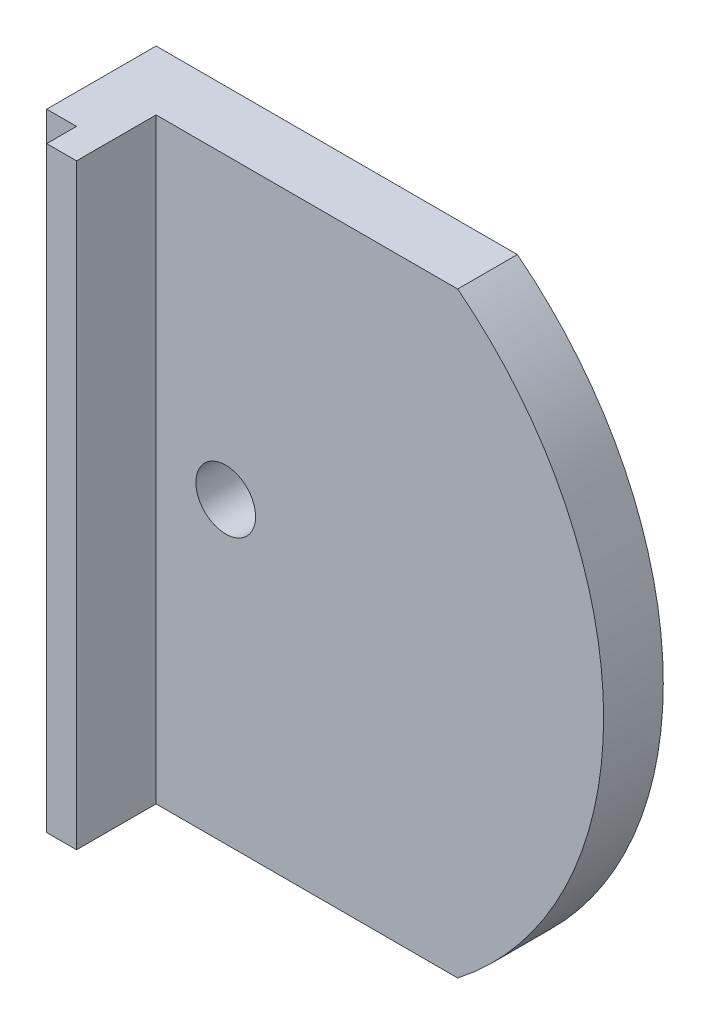
ISO-10303-21;
HEADER;
FILE_DESCRIPTION(('STEP AP214'),'2;1');
FILE_NAME('part.step','',(''),(''),'','','');
FILE_SCHEMA(('AUTOMOTIVE_DESIGN { 1 0 10303 214 1 1 1 1 }'));
ENDSEC;
DATA;
#1=APPLICATION_CONTEXT('core data for automotive mechanical design processes');
#2=APPLICATION_PROTOCOL_DEFINITION('international standard','automotive_design',2000,#1);
#3=PRODUCT_CONTEXT('',#1,'mechanical');
#4=PRODUCT('Part','Part','',(#3));
#5=PRODUCT_RELATED_PRODUCT_CATEGORY('part','',(#4));
#6=PRODUCT_DEFINITION_FORMATION('','',#4);
#7=PRODUCT_DEFINITION_CONTEXT('part definition',#1,'design');
#8=PRODUCT_DEFINITION('design','',#6,#7);
#9=PRODUCT_DEFINITION_SHAPE('','',#8);
#10=(LENGTH_UNIT() NAMED_UNIT(*) SI_UNIT(.MILLI.,.METRE.));
#11=(NAMED_UNIT(*) PLANE_ANGLE_UNIT() SI_UNIT($,.RADIAN.));
#12=(NAMED_UNIT(*) SI_UNIT($,.STERADIAN.) SOLID_ANGLE_UNIT());
#13=UNCERTAINTY_MEASURE_WITH_UNIT(LENGTH_MEASURE(1.E-05),#10,'distance_accuracy_value','');
#14=(GEOMETRIC_REPRESENTATION_CONTEXT(3) GLOBAL_UNCERTAINTY_ASSIGNED_CONTEXT((#13)) GLOBAL_UNIT_ASSIGNED_CONTEXT((#10,
#11,#12)) REPRESENTATION_CONTEXT('',''));
#15=CARTESIAN_POINT('',(0.,0.,0.));
#16=DIRECTION('',(0.,0.,1.));
#17=DIRECTION('',(1.,0.,0.));
#18=AXIS2_PLACEMENT_3D('',#15,#16,#17);
#19=CARTESIAN_POINT('',(0.,15.,0.));
#20=DIRECTION('',(0.,0.,-1.));
#21=DIRECTION('',(-1.,0.,0.));
#22=AXIS2_PLACEMENT_3D('',#19,#20,#21);
#23=PLANE('',#22);
#24=CARTESIAN_POINT('',(6.5,0.,0.));
#25=DIRECTION('',(0.,0.,-1.));
#26=DIRECTION('',(1.,0.,0.));
#27=AXIS2_PLACEMENT_3D('',#24,#25,#26);
#28=CIRCLE('',#27,19.);
#29=CARTESIAN_POINT('',(18.1619037896906,15.,0.));
#30=VERTEX_POINT('',#29);
#31=CARTESIAN_POINT('',(18.1619037896906,-15.,0.));
#32=VERTEX_POINT('',#31);
#33=EDGE_CURVE('E128',#30,#32,#28,.T.);
#34=ORIENTED_EDGE('',*,*,#33,.T.);
#35=DIRECTION('',(1.,0.,0.));
#36=VECTOR('',#35,1.);
#37=CARTESIAN_POINT('',(0.,-15.,0.));
#38=LINE('',#37,#36);
#39=CARTESIAN_POINT('',(0.,-15.,0.));
#40=VERTEX_POINT('',#39);
#41=EDGE_CURVE('E157',#40,#32,#38,.T.);
#42=ORIENTED_EDGE('',*,*,#41,.F.);
#43=DIRECTION('',(0.,-1.,0.));
#44=VECTOR('',#43,1.);
#45=CARTESIAN_POINT('',(0.,15.,0.));
#46=LINE('',#45,#44);
#47=CARTESIAN_POINT('',(0.,15.,0.));
#48=VERTEX_POINT('',#47);
#49=EDGE_CURVE('E11',#48,#40,#46,.T.);
#50=ORIENTED_EDGE('',*,*,#49,.F.);
#51=DIRECTION('',(1.,0.,0.));
#52=VECTOR('',#51,1.);
#53=CARTESIAN_POINT('',(0.,15.,0.));
#54=LINE('',#53,#52);
#55=EDGE_CURVE('E143',#48,#30,#54,.T.);
#56=ORIENTED_EDGE('',*,*,#55,.T.);
#57=EDGE_LOOP('',(#34,#42,#50,#56));
#58=FACE_BOUND('',#57,.T.);
#59=CARTESIAN_POINT('',(6.5,0.,0.));
#60=DIRECTION('',(0.,0.,-1.));
#61=DIRECTION('',(-1.,0.,0.));
#62=AXIS2_PLACEMENT_3D('',#59,#60,#61);
#63=CIRCLE('',#62,6.);
#64=CARTESIAN_POINT('',(0.5,0.,0.));
#65=VERTEX_POINT('',#64);
#66=EDGE_CURVE('E120',#65,#65,#63,.T.);
#67=ORIENTED_EDGE('',*,*,#66,.F.);
#68=EDGE_LOOP('',(#67));
#69=FACE_BOUND('',#68,.T.);
#70=ADVANCED_FACE('F32',(#58,#69),#23,.T.);
#71=CARTESIAN_POINT('',(0.,15.,3.));
#72=DIRECTION('',(0.,0.,-1.));
#73=DIRECTION('',(-1.,0.,0.));
#74=AXIS2_PLACEMENT_3D('',#71,#72,#73);
#75=PLANE('',#74);
#76=CARTESIAN_POINT('',(6.5,0.,3.));
#77=DIRECTION('',(0.,0.,1.));
#78=DIRECTION('',(1.,0.,0.));
#79=AXIS2_PLACEMENT_3D('',#76,#77,#78);
#80=CIRCLE('',#79,1.5);
#81=CARTESIAN_POINT('',(8.,0.,3.));
#82=VERTEX_POINT('',#81);
#83=EDGE_CURVE('E135',#82,#82,#80,.T.);
#84=ORIENTED_EDGE('',*,*,#83,.F.);
#85=EDGE_LOOP('',(#84));
#86=FACE_BOUND('',#85,.T.);
#87=DIRECTION('',(1.,0.,0.));
#88=VECTOR('',#87,1.);
#89=CARTESIAN_POINT('',(0.,-15.,3.));
#90=LINE('',#89,#88);
#91=CARTESIAN_POINT('',(3.,-15.,3.));
#92=VERTEX_POINT('',#91);
#93=CARTESIAN_POINT('',(18.1619037896906,-15.,3.));
#94=VERTEX_POINT('',#93);
#95=EDGE_CURVE('E139',#92,#94,#90,.T.);
#96=ORIENTED_EDGE('',*,*,#95,.T.);
#97=CARTESIAN_POINT('',(6.5,0.,3.));
#98=DIRECTION('',(0.,0.,-1.));
#99=DIRECTION('',(1.,0.,0.));
#100=AXIS2_PLACEMENT_3D('',#97,#98,#99);
#101=CIRCLE('',#100,19.);
#102=CARTESIAN_POINT('',(18.1619037896906,15.,3.));
#103=VERTEX_POINT('',#102);
#104=EDGE_CURVE('E55',#103,#94,#101,.T.);
#105=ORIENTED_EDGE('',*,*,#104,.F.);
#106=DIRECTION('',(1.,0.,0.));
#107=VECTOR('',#106,1.);
#108=CARTESIAN_POINT('',(0.,15.,3.));
#109=LINE('',#108,#107);
#110=CARTESIAN_POINT('',(3.,15.,3.));
#111=VERTEX_POINT('',#110);
#112=EDGE_CURVE('E140',#111,#103,#109,.T.);
#113=ORIENTED_EDGE('',*,*,#112,.F.);
#114=DIRECTION('',(0.,-1.,0.));
#115=VECTOR('',#114,1.);
#116=CARTESIAN_POINT('',(3.,15.,3.));
#117=LINE('',#116,#115);
#118=EDGE_CURVE('E154',#111,#92,#117,.T.);
#119=ORIENTED_EDGE('',*,*,#118,.T.);
#120=EDGE_LOOP('',(#96,#105,#113,#119));
#121=FACE_BOUND('',#120,.T.);
#122=ADVANCED_FACE('F34',(#86,#121),#75,.F.);
#123=CARTESIAN_POINT('',(0.,15.,7.));
#124=DIRECTION('',(-1.,0.,0.));
#125=DIRECTION('',(0.,0.,1.));
#126=AXIS2_PLACEMENT_3D('',#123,#124,#125);
#127=PLANE('',#126);
#128=DIRECTION('',(0.,1.,0.));
#129=VECTOR('',#128,1.);
#130=CARTESIAN_POINT('',(0.,-15.,5.5));
#131=LINE('',#130,#129);
#132=CARTESIAN_POINT('',(0.,-15.,5.5));
#133=VERTEX_POINT('',#132);
#134=CARTESIAN_POINT('',(0.,15.,5.5));
#135=VERTEX_POINT('',#134);
#136=EDGE_CURVE('E47',#133,#135,#131,.T.);
#137=ORIENTED_EDGE('',*,*,#136,.T.);
#138=DIRECTION('',(0.,0.,-1.));
#139=VECTOR('',#138,1.);
#140=CARTESIAN_POINT('',(0.,15.,7.));
#141=LINE('',#140,#139);
#142=EDGE_CURVE('E147',#135,#48,#141,.T.);
#143=ORIENTED_EDGE('',*,*,#142,.T.);
#144=ORIENTED_EDGE('',*,*,#49,.T.);
#145=DIRECTION('',(0.,0.,-1.));
#146=VECTOR('',#145,1.);
#147=CARTESIAN_POINT('',(0.,-15.,7.));
#148=LINE('',#147,#146);
#149=EDGE_CURVE('E160',#133,#40,#148,.T.);
#150=ORIENTED_EDGE('',*,*,#149,.F.);
#151=EDGE_LOOP('',(#137,#143,#144,#150));
#152=FACE_BOUND('',#151,.T.);
#153=ADVANCED_FACE('F178',(#152),#127,.T.);
#154=CARTESIAN_POINT('',(3.,15.,7.));
#155=DIRECTION('',(0.,0.,1.));
#156=DIRECTION('',(1.,0.,0.));
#157=AXIS2_PLACEMENT_3D('',#154,#155,#156);
#158=PLANE('',#157);
#159=DIRECTION('',(0.,1.,0.));
#160=VECTOR('',#159,1.);
#161=CARTESIAN_POINT('',(1.5,-15.,7.));
#162=LINE('',#161,#160);
#163=CARTESIAN_POINT('',(1.5,-15.,7.));
#164=VERTEX_POINT('',#163);
#165=CARTESIAN_POINT('',(1.5,15.,7.));
#166=VERTEX_POINT('',#165);
#167=EDGE_CURVE('E125',#164,#166,#162,.T.);
#168=ORIENTED_EDGE('',*,*,#167,.F.);
#169=DIRECTION('',(-1.,0.,0.));
#170=VECTOR('',#169,1.);
#171=CARTESIAN_POINT('',(3.,-15.,7.));
#172=LINE('',#171,#170);
#173=CARTESIAN_POINT('',(3.,-15.,7.));
#174=VERTEX_POINT('',#173);
#175=EDGE_CURVE('E115',#174,#164,#172,.T.);
#176=ORIENTED_EDGE('',*,*,#175,.F.);
#177=DIRECTION('',(0.,-1.,0.));
#178=VECTOR('',#177,1.);
#179=CARTESIAN_POINT('',(3.,15.,7.));
#180=LINE('',#179,#178);
#181=CARTESIAN_POINT('',(3.,15.,7.));
#182=VERTEX_POINT('',#181);
#183=EDGE_CURVE('E40',#182,#174,#180,.T.);
#184=ORIENTED_EDGE('',*,*,#183,.F.);
#185=DIRECTION('',(-1.,0.,0.));
#186=VECTOR('',#185,1.);
#187=CARTESIAN_POINT('',(3.,15.,7.));
#188=LINE('',#187,#186);
#189=EDGE_CURVE('E149',#182,#166,#188,.T.);
#190=ORIENTED_EDGE('',*,*,#189,.T.);
#191=EDGE_LOOP('',(#168,#176,#184,#190));
#192=FACE_BOUND('',#191,.T.);
#193=ADVANCED_FACE('F172',(#192),#158,.T.);
#194=CARTESIAN_POINT('',(3.,15.,7.));
#195=DIRECTION('',(-1.,0.,0.));
#196=DIRECTION('',(0.,0.,1.));
#197=AXIS2_PLACEMENT_3D('',#194,#195,#196);
#198=PLANE('',#197);
#199=DIRECTION('',(0.,0.,-1.));
#200=VECTOR('',#199,1.);
#201=CARTESIAN_POINT('',(3.,-15.,7.));
#202=LINE('',#201,#200);
#203=EDGE_CURVE('E144',#174,#92,#202,.T.);
#204=ORIENTED_EDGE('',*,*,#203,.T.);
#205=ORIENTED_EDGE('',*,*,#118,.F.);
#206=DIRECTION('',(0.,0.,-1.));
#207=VECTOR('',#206,1.);
#208=CARTESIAN_POINT('',(3.,15.,7.));
#209=LINE('',#208,#207);
#210=EDGE_CURVE('E152',#182,#111,#209,.T.);
#211=ORIENTED_EDGE('',*,*,#210,.F.);
#212=ORIENTED_EDGE('',*,*,#183,.T.);
#213=EDGE_LOOP('',(#204,#205,#211,#212));
#214=FACE_BOUND('',#213,.T.);
#215=ADVANCED_FACE('F167',(#214),#198,.F.);
#216=CARTESIAN_POINT('',(0.,15.,0.));
#217=DIRECTION('',(0.,-1.,0.));
#218=DIRECTION('',(-1.,0.,0.));
#219=AXIS2_PLACEMENT_3D('',#216,#217,#218);
#220=PLANE('',#219);
#221=DIRECTION('',(-1.,0.,0.));
#222=VECTOR('',#221,1.);
#223=CARTESIAN_POINT('',(1.5,15.,5.5));
#224=LINE('',#223,#222);
#225=CARTESIAN_POINT('',(1.5,15.,5.5));
#226=VERTEX_POINT('',#225);
#227=EDGE_CURVE('E116',#226,#135,#224,.T.);
#228=ORIENTED_EDGE('',*,*,#227,.F.);
#229=DIRECTION('',(0.,0.,-1.));
#230=VECTOR('',#229,1.);
#231=CARTESIAN_POINT('',(1.5,15.,7.));
#232=LINE('',#231,#230);
#233=EDGE_CURVE('E103',#166,#226,#232,.T.);
#234=ORIENTED_EDGE('',*,*,#233,.F.);
#235=ORIENTED_EDGE('',*,*,#189,.F.);
#236=ORIENTED_EDGE('',*,*,#210,.T.);
#237=ORIENTED_EDGE('',*,*,#112,.T.);
#238=DIRECTION('',(0.,0.,1.));
#239=VECTOR('',#238,1.);
#240=CARTESIAN_POINT('',(18.1619037896906,15.,0.));
#241=LINE('',#240,#239);
#242=EDGE_CURVE('E131',#30,#103,#241,.T.);
#243=ORIENTED_EDGE('',*,*,#242,.F.);
#244=ORIENTED_EDGE('',*,*,#55,.F.);
#245=ORIENTED_EDGE('',*,*,#142,.F.);
#246=EDGE_LOOP('',(#228,#234,#235,#236,#237,#243,#244,#245));
#247=FACE_BOUND('',#246,.T.);
#248=ADVANCED_FACE('F174',(#247),#220,.F.);
#249=CARTESIAN_POINT('',(0.,-15.,0.));
#250=DIRECTION('',(0.,-1.,0.));
#251=DIRECTION('',(-1.,0.,0.));
#252=AXIS2_PLACEMENT_3D('',#249,#250,#251);
#253=PLANE('',#252);
#254=DIRECTION('',(0.,0.,-1.));
#255=VECTOR('',#254,1.);
#256=CARTESIAN_POINT('',(1.5,-15.,7.));
#257=LINE('',#256,#255);
#258=CARTESIAN_POINT('',(1.5,-15.,5.5));
#259=VERTEX_POINT('',#258);
#260=EDGE_CURVE('E100',#164,#259,#257,.T.);
#261=ORIENTED_EDGE('',*,*,#260,.T.);
#262=DIRECTION('',(-1.,0.,0.));
#263=VECTOR('',#262,1.);
#264=CARTESIAN_POINT('',(1.5,-15.,5.5));
#265=LINE('',#264,#263);
#266=EDGE_CURVE('E105',#259,#133,#265,.T.);
#267=ORIENTED_EDGE('',*,*,#266,.T.);
#268=ORIENTED_EDGE('',*,*,#149,.T.);
#269=ORIENTED_EDGE('',*,*,#41,.T.);
#270=DIRECTION('',(0.,0.,1.));
#271=VECTOR('',#270,1.);
#272=CARTESIAN_POINT('',(18.1619037896906,-15.,0.));
#273=LINE('',#272,#271);
#274=EDGE_CURVE('E133',#32,#94,#273,.T.);
#275=ORIENTED_EDGE('',*,*,#274,.T.);
#276=ORIENTED_EDGE('',*,*,#95,.F.);
#277=ORIENTED_EDGE('',*,*,#203,.F.);
#278=ORIENTED_EDGE('',*,*,#175,.T.);
#279=EDGE_LOOP('',(#261,#267,#268,#269,#275,#276,#277,#278));
#280=FACE_BOUND('',#279,.T.);
#281=ADVANCED_FACE('F112',(#280),#253,.T.);
#282=CARTESIAN_POINT('',(6.5,0.,0.));
#283=DIRECTION('',(0.,0.,1.));
#284=DIRECTION('',(1.,0.,0.));
#285=AXIS2_PLACEMENT_3D('',#282,#283,#284);
#286=CYLINDRICAL_SURFACE('',#285,1.5);
#287=ORIENTED_EDGE('',*,*,#83,.T.);
#288=EDGE_LOOP('',(#287));
#289=FACE_BOUND('',#288,.T.);
#290=CARTESIAN_POINT('',(6.5,0.,-2.));
#291=DIRECTION('',(0.,0.,-1.));
#292=DIRECTION('',(-1.,0.,0.));
#293=AXIS2_PLACEMENT_3D('',#290,#291,#292);
#294=CIRCLE('',#293,1.5);
#295=CARTESIAN_POINT('',(5.,0.,-2.));
#296=VERTEX_POINT('',#295);
#297=EDGE_CURVE('E202',#296,#296,#294,.T.);
#298=ORIENTED_EDGE('',*,*,#297,.T.);
#299=EDGE_LOOP('',(#298));
#300=FACE_BOUND('',#299,.T.);
#301=ADVANCED_FACE('F196',(#289,#300),#286,.F.);
#302=CARTESIAN_POINT('',(6.5,0.,0.));
#303=DIRECTION('',(0.,0.,1.));
#304=DIRECTION('',(1.,0.,0.));
#305=AXIS2_PLACEMENT_3D('',#302,#303,#304);
#306=CYLINDRICAL_SURFACE('',#305,19.);
#307=ORIENTED_EDGE('',*,*,#104,.T.);
#308=ORIENTED_EDGE('',*,*,#274,.F.);
#309=ORIENTED_EDGE('',*,*,#33,.F.);
#310=ORIENTED_EDGE('',*,*,#242,.T.);
#311=EDGE_LOOP('',(#307,#308,#309,#310));
#312=FACE_BOUND('',#311,.T.);
#313=ADVANCED_FACE('F184',(#312),#306,.T.);
#314=CARTESIAN_POINT('',(1.5,-15.,7.));
#315=DIRECTION('',(1.,0.,0.));
#316=DIRECTION('',(0.,0.,-1.));
#317=AXIS2_PLACEMENT_3D('',#314,#315,#316);
#318=PLANE('',#317);
#319=ORIENTED_EDGE('',*,*,#233,.T.);
#320=DIRECTION('',(0.,1.,0.));
#321=VECTOR('',#320,1.);
#322=CARTESIAN_POINT('',(1.5,-15.,5.5));
#323=LINE('',#322,#321);
#324=EDGE_CURVE('E97',#259,#226,#323,.T.);
#325=ORIENTED_EDGE('',*,*,#324,.F.);
#326=ORIENTED_EDGE('',*,*,#260,.F.);
#327=ORIENTED_EDGE('',*,*,#167,.T.);
#328=EDGE_LOOP('',(#319,#325,#326,#327));
#329=FACE_BOUND('',#328,.T.);
#330=ADVANCED_FACE('F98',(#329),#318,.F.);
#331=CARTESIAN_POINT('',(1.5,-15.,5.5));
#332=DIRECTION('',(0.,0.,-1.));
#333=DIRECTION('',(-1.,0.,0.));
#334=AXIS2_PLACEMENT_3D('',#331,#332,#333);
#335=PLANE('',#334);
#336=ORIENTED_EDGE('',*,*,#227,.T.);
#337=ORIENTED_EDGE('',*,*,#136,.F.);
#338=ORIENTED_EDGE('',*,*,#266,.F.);
#339=ORIENTED_EDGE('',*,*,#324,.T.);
#340=EDGE_LOOP('',(#336,#337,#338,#339));
#341=FACE_BOUND('',#340,.T.);
#342=ADVANCED_FACE('F107',(#341),#335,.F.);
#343=CARTESIAN_POINT('',(6.5,0.,-2.));
#344=DIRECTION('',(0.,0.,-1.));
#345=DIRECTION('',(-1.,0.,0.));
#346=AXIS2_PLACEMENT_3D('',#343,#344,#345);
#347=PLANE('',#346);
#348=CARTESIAN_POINT('',(6.5,0.,-2.));
#349=DIRECTION('',(0.,0.,-1.));
#350=DIRECTION('',(-1.,0.,0.));
#351=AXIS2_PLACEMENT_3D('',#348,#349,#350);
#352=CIRCLE('',#351,6.);
#353=CARTESIAN_POINT('',(0.5,0.,-2.));
#354=VERTEX_POINT('',#353);
#355=EDGE_CURVE('E123',#354,#354,#352,.T.);
#356=ORIENTED_EDGE('',*,*,#355,.T.);
#357=EDGE_LOOP('',(#356));
#358=FACE_BOUND('',#357,.T.);
#359=ORIENTED_EDGE('',*,*,#297,.F.);
#360=EDGE_LOOP('',(#359));
#361=FACE_BOUND('',#360,.T.);
#362=ADVANCED_FACE('F209',(#358,#361),#347,.T.);
#363=CARTESIAN_POINT('',(6.5,0.,-2.));
#364=DIRECTION('',(0.,0.,1.));
#365=DIRECTION('',(1.,0.,0.));
#366=AXIS2_PLACEMENT_3D('',#363,#364,#365);
#367=CYLINDRICAL_SURFACE('',#366,6.);
#368=ORIENTED_EDGE('',*,*,#355,.F.);
#369=EDGE_LOOP('',(#368));
#370=FACE_BOUND('',#369,.T.);
#371=ORIENTED_EDGE('',*,*,#66,.T.);
#372=EDGE_LOOP('',(#371));
#373=FACE_BOUND('',#372,.T.);
#374=ADVANCED_FACE('F211',(#370,#373),#367,.T.);
#375=CLOSED_SHELL('',(#70,#122,#153,#193,#215,#248,#281,#301,#313,#330,#342,#362,#374));
#376=MANIFOLD_SOLID_BREP('B2',#375);
#377=ADVANCED_BREP_SHAPE_REPRESENTATION('',(#18,#376),#14);
#378=SHAPE_DEFINITION_REPRESENTATION(#9,#377);
ENDSEC;
END-ISO-10303-21;
